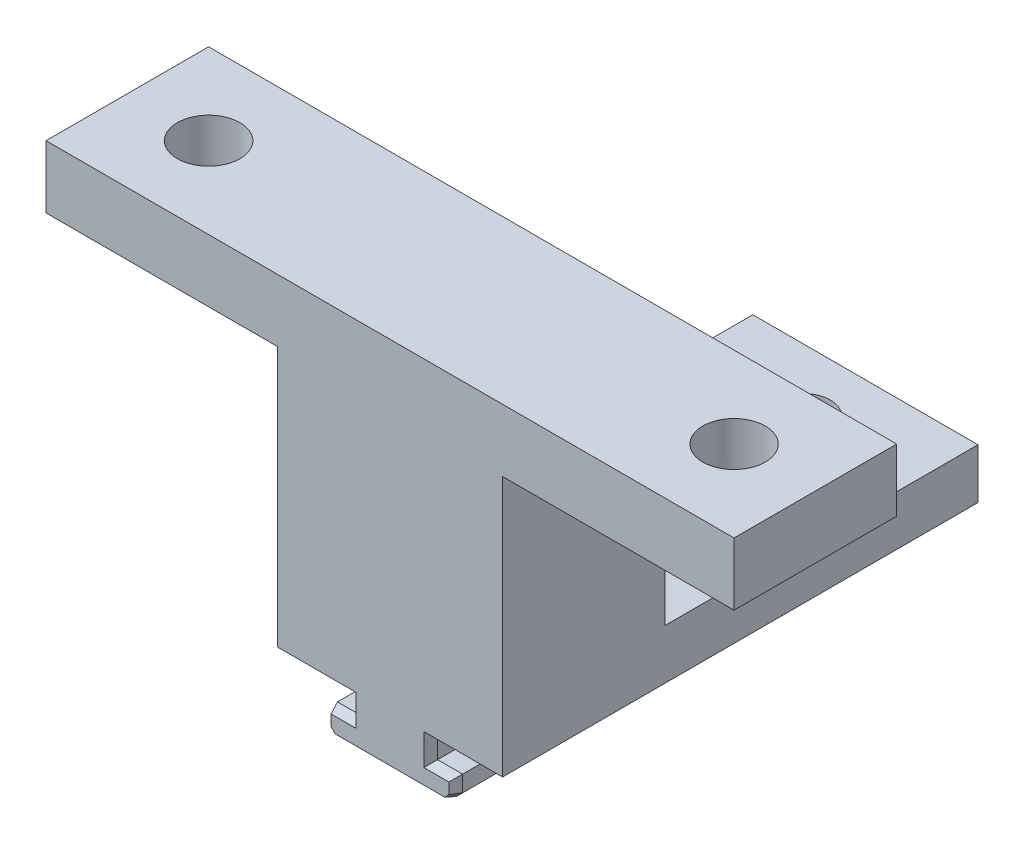
ISO-10303-21;
HEADER;
FILE_DESCRIPTION(('STEP AP214'),'2;1');
FILE_NAME('part.step','',(''),(''),'','','');
FILE_SCHEMA(('AUTOMOTIVE_DESIGN { 1 0 10303 214 1 1 1 1 }'));
ENDSEC;
DATA;
#1=APPLICATION_CONTEXT('core data for automotive mechanical design processes');
#2=APPLICATION_PROTOCOL_DEFINITION('international standard','automotive_design',2000,#1);
#3=PRODUCT_CONTEXT('',#1,'mechanical');
#4=PRODUCT('Part','Part','',(#3));
#5=PRODUCT_RELATED_PRODUCT_CATEGORY('part','',(#4));
#6=PRODUCT_DEFINITION_FORMATION('','',#4);
#7=PRODUCT_DEFINITION_CONTEXT('part definition',#1,'design');
#8=PRODUCT_DEFINITION('design','',#6,#7);
#9=PRODUCT_DEFINITION_SHAPE('','',#8);
#10=(LENGTH_UNIT() NAMED_UNIT(*) SI_UNIT(.MILLI.,.METRE.));
#11=(NAMED_UNIT(*) PLANE_ANGLE_UNIT() SI_UNIT($,.RADIAN.));
#12=(NAMED_UNIT(*) SI_UNIT($,.STERADIAN.) SOLID_ANGLE_UNIT());
#13=UNCERTAINTY_MEASURE_WITH_UNIT(LENGTH_MEASURE(1.E-05),#10,'distance_accuracy_value','');
#14=(GEOMETRIC_REPRESENTATION_CONTEXT(3) GLOBAL_UNCERTAINTY_ASSIGNED_CONTEXT((#13)) GLOBAL_UNIT_ASSIGNED_CONTEXT((#10,
#11,#12)) REPRESENTATION_CONTEXT('',''));
#15=CARTESIAN_POINT('',(0.,0.,0.));
#16=DIRECTION('',(0.,0.,1.));
#17=DIRECTION('',(1.,0.,0.));
#18=AXIS2_PLACEMENT_3D('',#15,#16,#17);
#19=CARTESIAN_POINT('',(0.,10.,13.));
#20=DIRECTION('',(0.,-1.,0.));
#21=DIRECTION('',(0.,0.,-1.));
#22=AXIS2_PLACEMENT_3D('',#19,#20,#21);
#23=PLANE('',#22);
#24=CARTESIAN_POINT('',(0.,10.,-20.));
#25=DIRECTION('',(0.,-1.,0.));
#26=DIRECTION('',(0.,0.,-1.));
#27=AXIS2_PLACEMENT_3D('',#24,#25,#26);
#28=CIRCLE('',#27,2.2);
#29=CARTESIAN_POINT('',(0.,10.,-22.2));
#30=VERTEX_POINT('',#29);
#31=EDGE_CURVE('E241',#30,#30,#28,.T.);
#32=ORIENTED_EDGE('',*,*,#31,.F.);
#33=EDGE_LOOP('',(#32));
#34=FACE_BOUND('',#33,.T.);
#35=DIRECTION('',(-1.,0.,0.));
#36=VECTOR('',#35,1.);
#37=CARTESIAN_POINT('',(0.,10.,13.));
#38=LINE('',#37,#36);
#39=CARTESIAN_POINT('',(9.,10.,13.));
#40=VERTEX_POINT('',#39);
#41=CARTESIAN_POINT('',(2.70882381258704,10.,13.));
#42=VERTEX_POINT('',#41);
#43=EDGE_CURVE('E390',#40,#42,#38,.T.);
#44=ORIENTED_EDGE('',*,*,#43,.T.);
#45=DIRECTION('',(-0.342020143325668,0.,0.939692620785909));
#46=VECTOR('',#45,1.);
#47=CARTESIAN_POINT('',(3.,10.,12.2));
#48=LINE('',#47,#46);
#49=CARTESIAN_POINT('',(3.,10.,12.2));
#50=VERTEX_POINT('',#49);
#51=EDGE_CURVE('E12',#42,#50,#48,.F.);
#52=ORIENTED_EDGE('',*,*,#51,.T.);
#53=DIRECTION('',(0.,0.,-1.));
#54=VECTOR('',#53,1.);
#55=CARTESIAN_POINT('',(3.,10.,13.));
#56=LINE('',#55,#54);
#57=CARTESIAN_POINT('',(3.,10.,-13.));
#58=VERTEX_POINT('',#57);
#59=EDGE_CURVE('E283',#50,#58,#56,.T.);
#60=ORIENTED_EDGE('',*,*,#59,.T.);
#61=DIRECTION('',(1.,0.,0.));
#62=VECTOR('',#61,1.);
#63=CARTESIAN_POINT('',(0.,10.,-13.));
#64=LINE('',#63,#62);
#65=CARTESIAN_POINT('',(-3.,10.,-13.));
#66=VERTEX_POINT('',#65);
#67=EDGE_CURVE('E240',#66,#58,#64,.T.);
#68=ORIENTED_EDGE('',*,*,#67,.F.);
#69=DIRECTION('',(0.,0.,-1.));
#70=VECTOR('',#69,1.);
#71=CARTESIAN_POINT('',(-3.,10.,13.));
#72=LINE('',#71,#70);
#73=CARTESIAN_POINT('',(-3.,10.,12.2));
#74=VERTEX_POINT('',#73);
#75=EDGE_CURVE('E273',#74,#66,#72,.T.);
#76=ORIENTED_EDGE('',*,*,#75,.F.);
#77=DIRECTION('',(0.342020143325668,0.,0.939692620785909));
#78=VECTOR('',#77,1.);
#79=CARTESIAN_POINT('',(-2.70882381258704,10.,13.));
#80=LINE('',#79,#78);
#81=CARTESIAN_POINT('',(-2.70882381258704,10.,13.));
#82=VERTEX_POINT('',#81);
#83=EDGE_CURVE('E46',#74,#82,#80,.T.);
#84=ORIENTED_EDGE('',*,*,#83,.T.);
#85=CARTESIAN_POINT('',(-9.,10.,13.));
#86=VERTEX_POINT('',#85);
#87=EDGE_CURVE('E217',#82,#86,#38,.T.);
#88=ORIENTED_EDGE('',*,*,#87,.T.);
#89=DIRECTION('',(0.,0.,-1.));
#90=VECTOR('',#89,1.);
#91=CARTESIAN_POINT('',(-9.,10.,13.));
#92=LINE('',#91,#90);
#93=CARTESIAN_POINT('',(-9.,10.,-25.));
#94=VERTEX_POINT('',#93);
#95=EDGE_CURVE('E276',#86,#94,#92,.T.);
#96=ORIENTED_EDGE('',*,*,#95,.T.);
#97=DIRECTION('',(-1.,0.,0.));
#98=VECTOR('',#97,1.);
#99=CARTESIAN_POINT('',(0.,10.,-25.));
#100=LINE('',#99,#98);
#101=CARTESIAN_POINT('',(9.,10.,-25.));
#102=VERTEX_POINT('',#101);
#103=EDGE_CURVE('E242',#102,#94,#100,.T.);
#104=ORIENTED_EDGE('',*,*,#103,.F.);
#105=DIRECTION('',(0.,0.,-1.));
#106=VECTOR('',#105,1.);
#107=CARTESIAN_POINT('',(9.,10.,13.));
#108=LINE('',#107,#106);
#109=EDGE_CURVE('E286',#40,#102,#108,.T.);
#110=ORIENTED_EDGE('',*,*,#109,.F.);
#111=EDGE_LOOP('',(#44,#52,#60,#68,#76,#84,#88,#96,#104,#110));
#112=FACE_BOUND('',#111,.T.);
#113=ADVANCED_FACE('F37',(#34,#112),#23,.T.);
#114=CARTESIAN_POINT('',(0.,0.,0.));
#115=DIRECTION('',(0.,0.,1.));
#116=DIRECTION('',(1.,0.,0.));
#117=AXIS2_PLACEMENT_3D('',#114,#115,#116);
#118=PLANE('',#117);
#119=DIRECTION('',(1.,0.,0.));
#120=VECTOR('',#119,1.);
#121=CARTESIAN_POINT('',(0.,14.,0.));
#122=LINE('',#121,#120);
#123=CARTESIAN_POINT('',(-9.,14.,0.));
#124=VERTEX_POINT('',#123);
#125=CARTESIAN_POINT('',(9.,14.,0.));
#126=VERTEX_POINT('',#125);
#127=EDGE_CURVE('E229',#124,#126,#122,.T.);
#128=ORIENTED_EDGE('',*,*,#127,.F.);
#129=DIRECTION('',(0.,1.,0.));
#130=VECTOR('',#129,1.);
#131=CARTESIAN_POINT('',(-9.,0.,0.));
#132=LINE('',#131,#130);
#133=CARTESIAN_POINT('',(-9.,30.8000000000001,0.));
#134=VERTEX_POINT('',#133);
#135=EDGE_CURVE('E387',#124,#134,#132,.T.);
#136=ORIENTED_EDGE('',*,*,#135,.T.);
#137=DIRECTION('',(-1.,0.,0.));
#138=VECTOR('',#137,1.);
#139=CARTESIAN_POINT('',(-1.09747046285582E-13,30.8000000000001,0.));
#140=LINE('',#139,#138);
#141=CARTESIAN_POINT('',(-27.5,30.8000000000001,0.));
#142=VERTEX_POINT('',#141);
#143=EDGE_CURVE('E391',#134,#142,#140,.T.);
#144=ORIENTED_EDGE('',*,*,#143,.T.);
#145=DIRECTION('',(0.,-1.,0.));
#146=VECTOR('',#145,1.);
#147=CARTESIAN_POINT('',(-27.5,0.,0.));
#148=LINE('',#147,#146);
#149=CARTESIAN_POINT('',(-27.5,35.8000000000001,0.));
#150=VERTEX_POINT('',#149);
#151=EDGE_CURVE('E574',#150,#142,#148,.T.);
#152=ORIENTED_EDGE('',*,*,#151,.F.);
#153=DIRECTION('',(1.,0.,0.));
#154=VECTOR('',#153,1.);
#155=CARTESIAN_POINT('',(0.,35.8000000000001,0.));
#156=LINE('',#155,#154);
#157=CARTESIAN_POINT('',(27.5,35.8000000000001,0.));
#158=VERTEX_POINT('',#157);
#159=EDGE_CURVE('E572',#150,#158,#156,.T.);
#160=ORIENTED_EDGE('',*,*,#159,.T.);
#161=DIRECTION('',(0.,-1.,0.));
#162=VECTOR('',#161,1.);
#163=CARTESIAN_POINT('',(27.5,0.,0.));
#164=LINE('',#163,#162);
#165=CARTESIAN_POINT('',(27.5,30.8000000000001,0.));
#166=VERTEX_POINT('',#165);
#167=EDGE_CURVE('E569',#158,#166,#164,.T.);
#168=ORIENTED_EDGE('',*,*,#167,.T.);
#169=DIRECTION('',(1.,0.,0.));
#170=VECTOR('',#169,1.);
#171=CARTESIAN_POINT('',(1.09747046285582E-13,30.8000000000001,0.));
#172=LINE('',#171,#170);
#173=CARTESIAN_POINT('',(9.,30.8000000000001,0.));
#174=VERTEX_POINT('',#173);
#175=EDGE_CURVE('E566',#174,#166,#172,.T.);
#176=ORIENTED_EDGE('',*,*,#175,.F.);
#177=DIRECTION('',(0.,1.,0.));
#178=VECTOR('',#177,1.);
#179=CARTESIAN_POINT('',(9.,0.,0.));
#180=LINE('',#179,#178);
#181=EDGE_CURVE('E392',#126,#174,#180,.T.);
#182=ORIENTED_EDGE('',*,*,#181,.F.);
#183=EDGE_LOOP('',(#128,#136,#144,#152,#160,#168,#176,#182));
#184=FACE_BOUND('',#183,.T.);
#185=ADVANCED_FACE('F453',(#184),#118,.F.);
#186=CARTESIAN_POINT('',(0.,7.8,13.));
#187=DIRECTION('',(0.,1.,0.));
#188=DIRECTION('',(0.,0.,1.));
#189=AXIS2_PLACEMENT_3D('',#186,#187,#188);
#190=PLANE('',#189);
#191=DIRECTION('',(0.,0.,-1.));
#192=VECTOR('',#191,1.);
#193=CARTESIAN_POINT('',(3.,7.8,13.));
#194=LINE('',#193,#192);
#195=CARTESIAN_POINT('',(3.,7.8,12.2));
#196=VERTEX_POINT('',#195);
#197=CARTESIAN_POINT('',(3.,7.8,-13.));
#198=VERTEX_POINT('',#197);
#199=EDGE_CURVE('E285',#196,#198,#194,.T.);
#200=ORIENTED_EDGE('',*,*,#199,.F.);
#201=DIRECTION('',(1.,0.,0.));
#202=VECTOR('',#201,1.);
#203=CARTESIAN_POINT('',(0.,7.8,12.2));
#204=LINE('',#203,#202);
#205=CARTESIAN_POINT('',(5.,7.8,12.2));
#206=VERTEX_POINT('',#205);
#207=EDGE_CURVE('E212',#196,#206,#204,.T.);
#208=ORIENTED_EDGE('',*,*,#207,.T.);
#209=DIRECTION('',(0.,0.,-1.));
#210=VECTOR('',#209,1.);
#211=CARTESIAN_POINT('',(5.,7.8,13.));
#212=LINE('',#211,#210);
#213=CARTESIAN_POINT('',(5.,7.8,-13.));
#214=VERTEX_POINT('',#213);
#215=EDGE_CURVE('E206',#206,#214,#212,.T.);
#216=ORIENTED_EDGE('',*,*,#215,.T.);
#217=DIRECTION('',(-1.,0.,0.));
#218=VECTOR('',#217,1.);
#219=CARTESIAN_POINT('',(0.,7.8,-13.));
#220=LINE('',#219,#218);
#221=EDGE_CURVE('E210',#214,#198,#220,.T.);
#222=ORIENTED_EDGE('',*,*,#221,.T.);
#223=EDGE_LOOP('',(#200,#208,#216,#222));
#224=FACE_BOUND('',#223,.T.);
#225=ADVANCED_FACE('F209',(#224),#190,.T.);
#226=CARTESIAN_POINT('',(3.,0.,13.));
#227=DIRECTION('',(1.,0.,0.));
#228=DIRECTION('',(0.,0.,-1.));
#229=AXIS2_PLACEMENT_3D('',#226,#227,#228);
#230=PLANE('',#229);
#231=ORIENTED_EDGE('',*,*,#59,.F.);
#232=DIRECTION('',(0.,-1.,0.));
#233=VECTOR('',#232,1.);
#234=CARTESIAN_POINT('',(3.,0.,12.2));
#235=LINE('',#234,#233);
#236=EDGE_CURVE('E282',#50,#196,#235,.T.);
#237=ORIENTED_EDGE('',*,*,#236,.T.);
#238=ORIENTED_EDGE('',*,*,#199,.T.);
#239=DIRECTION('',(0.,1.,0.));
#240=VECTOR('',#239,1.);
#241=CARTESIAN_POINT('',(3.,0.,-13.));
#242=LINE('',#241,#240);
#243=EDGE_CURVE('E228',#198,#58,#242,.T.);
#244=ORIENTED_EDGE('',*,*,#243,.T.);
#245=EDGE_LOOP('',(#231,#237,#238,#244));
#246=FACE_BOUND('',#245,.T.);
#247=ADVANCED_FACE('F491',(#246),#230,.T.);
#248=CARTESIAN_POINT('',(9.,0.,13.));
#249=DIRECTION('',(-1.,0.,0.));
#250=DIRECTION('',(0.,0.,1.));
#251=AXIS2_PLACEMENT_3D('',#248,#249,#250);
#252=PLANE('',#251);
#253=ORIENTED_EDGE('',*,*,#109,.T.);
#254=DIRECTION('',(0.,1.,0.));
#255=VECTOR('',#254,1.);
#256=CARTESIAN_POINT('',(9.,0.,-25.));
#257=LINE('',#256,#255);
#258=CARTESIAN_POINT('',(9.,14.,-25.));
#259=VERTEX_POINT('',#258);
#260=EDGE_CURVE('E245',#102,#259,#257,.T.);
#261=ORIENTED_EDGE('',*,*,#260,.T.);
#262=DIRECTION('',(0.,0.,1.));
#263=VECTOR('',#262,1.);
#264=CARTESIAN_POINT('',(9.,14.,-25.));
#265=LINE('',#264,#263);
#266=EDGE_CURVE('E252',#259,#126,#265,.T.);
#267=ORIENTED_EDGE('',*,*,#266,.T.);
#268=ORIENTED_EDGE('',*,*,#181,.T.);
#269=DIRECTION('',(0.,0.,-1.));
#270=VECTOR('',#269,1.);
#271=CARTESIAN_POINT('',(9.,30.8000000000001,13.));
#272=LINE('',#271,#270);
#273=CARTESIAN_POINT('',(9.,30.8000000000001,13.));
#274=VERTEX_POINT('',#273);
#275=EDGE_CURVE('E377',#274,#174,#272,.T.);
#276=ORIENTED_EDGE('',*,*,#275,.F.);
#277=DIRECTION('',(0.,1.,0.));
#278=VECTOR('',#277,1.);
#279=CARTESIAN_POINT('',(9.,0.,13.));
#280=LINE('',#279,#278);
#281=EDGE_CURVE('E549',#40,#274,#280,.T.);
#282=ORIENTED_EDGE('',*,*,#281,.F.);
#283=EDGE_LOOP('',(#253,#261,#267,#268,#276,#282));
#284=FACE_BOUND('',#283,.T.);
#285=ADVANCED_FACE('F487',(#284),#252,.F.);
#286=CARTESIAN_POINT('',(1.09747046285582E-13,30.8000000000001,13.));
#287=DIRECTION('',(0.,1.,0.));
#288=DIRECTION('',(-1.,0.,0.));
#289=AXIS2_PLACEMENT_3D('',#286,#287,#288);
#290=PLANE('',#289);
#291=CARTESIAN_POINT('',(21.,30.8000000000001,6.49999999999999));
#292=DIRECTION('',(0.,1.,0.));
#293=DIRECTION('',(-1.,0.,0.));
#294=AXIS2_PLACEMENT_3D('',#291,#292,#293);
#295=CIRCLE('',#294,2.5);
#296=CARTESIAN_POINT('',(18.5,30.8000000000001,6.49999999999999));
#297=VERTEX_POINT('',#296);
#298=EDGE_CURVE('E594',#297,#297,#295,.T.);
#299=ORIENTED_EDGE('',*,*,#298,.T.);
#300=EDGE_LOOP('',(#299));
#301=FACE_BOUND('',#300,.T.);
#302=ORIENTED_EDGE('',*,*,#175,.T.);
#303=DIRECTION('',(0.,0.,-1.));
#304=VECTOR('',#303,1.);
#305=CARTESIAN_POINT('',(27.5,30.8000000000001,13.));
#306=LINE('',#305,#304);
#307=CARTESIAN_POINT('',(27.5,30.8000000000001,13.));
#308=VERTEX_POINT('',#307);
#309=EDGE_CURVE('E375',#308,#166,#306,.T.);
#310=ORIENTED_EDGE('',*,*,#309,.F.);
#311=DIRECTION('',(1.,0.,0.));
#312=VECTOR('',#311,1.);
#313=CARTESIAN_POINT('',(1.09747046285582E-13,30.8000000000001,13.));
#314=LINE('',#313,#312);
#315=EDGE_CURVE('E550',#274,#308,#314,.T.);
#316=ORIENTED_EDGE('',*,*,#315,.F.);
#317=ORIENTED_EDGE('',*,*,#275,.T.);
#318=EDGE_LOOP('',(#302,#310,#316,#317));
#319=FACE_BOUND('',#318,.T.);
#320=ADVANCED_FACE('F483',(#301,#319),#290,.F.);
#321=CARTESIAN_POINT('',(27.5,0.,13.));
#322=DIRECTION('',(1.,0.,0.));
#323=DIRECTION('',(0.,1.,0.));
#324=AXIS2_PLACEMENT_3D('',#321,#322,#323);
#325=PLANE('',#324);
#326=ORIENTED_EDGE('',*,*,#167,.F.);
#327=DIRECTION('',(0.,0.,-1.));
#328=VECTOR('',#327,1.);
#329=CARTESIAN_POINT('',(27.5,35.8000000000001,13.));
#330=LINE('',#329,#328);
#331=CARTESIAN_POINT('',(27.5,35.8000000000001,13.));
#332=VERTEX_POINT('',#331);
#333=EDGE_CURVE('E373',#332,#158,#330,.T.);
#334=ORIENTED_EDGE('',*,*,#333,.F.);
#335=DIRECTION('',(0.,-1.,0.));
#336=VECTOR('',#335,1.);
#337=CARTESIAN_POINT('',(27.5,0.,13.));
#338=LINE('',#337,#336);
#339=EDGE_CURVE('E553',#332,#308,#338,.T.);
#340=ORIENTED_EDGE('',*,*,#339,.T.);
#341=ORIENTED_EDGE('',*,*,#309,.T.);
#342=EDGE_LOOP('',(#326,#334,#340,#341));
#343=FACE_BOUND('',#342,.T.);
#344=ADVANCED_FACE('F479',(#343),#325,.T.);
#345=CARTESIAN_POINT('',(0.,35.8000000000001,13.));
#346=DIRECTION('',(0.,1.,0.));
#347=DIRECTION('',(0.,0.,1.));
#348=AXIS2_PLACEMENT_3D('',#345,#346,#347);
#349=PLANE('',#348);
#350=CARTESIAN_POINT('',(-21.,35.8000000000001,6.5));
#351=DIRECTION('',(0.,1.,0.));
#352=DIRECTION('',(0.,0.,-1.));
#353=AXIS2_PLACEMENT_3D('',#350,#351,#352);
#354=CIRCLE('',#353,2.5);
#355=CARTESIAN_POINT('',(-21.,35.8000000000001,4.));
#356=VERTEX_POINT('',#355);
#357=EDGE_CURVE('E255',#356,#356,#354,.T.);
#358=ORIENTED_EDGE('',*,*,#357,.F.);
#359=EDGE_LOOP('',(#358));
#360=FACE_BOUND('',#359,.T.);
#361=CARTESIAN_POINT('',(21.,35.8000000000001,6.49999999999999));
#362=DIRECTION('',(0.,1.,0.));
#363=DIRECTION('',(0.,0.,1.));
#364=AXIS2_PLACEMENT_3D('',#361,#362,#363);
#365=CIRCLE('',#364,2.5);
#366=CARTESIAN_POINT('',(21.,35.8000000000001,8.99999999999999));
#367=VERTEX_POINT('',#366);
#368=EDGE_CURVE('E386',#367,#367,#365,.T.);
#369=ORIENTED_EDGE('',*,*,#368,.F.);
#370=EDGE_LOOP('',(#369));
#371=FACE_BOUND('',#370,.T.);
#372=ORIENTED_EDGE('',*,*,#159,.F.);
#373=DIRECTION('',(0.,0.,-1.));
#374=VECTOR('',#373,1.);
#375=CARTESIAN_POINT('',(-27.5,35.8000000000001,13.));
#376=LINE('',#375,#374);
#377=CARTESIAN_POINT('',(-27.5,35.8000000000001,13.));
#378=VERTEX_POINT('',#377);
#379=EDGE_CURVE('E371',#378,#150,#376,.T.);
#380=ORIENTED_EDGE('',*,*,#379,.F.);
#381=DIRECTION('',(1.,0.,0.));
#382=VECTOR('',#381,1.);
#383=CARTESIAN_POINT('',(0.,35.8000000000001,13.));
#384=LINE('',#383,#382);
#385=EDGE_CURVE('E558',#378,#332,#384,.T.);
#386=ORIENTED_EDGE('',*,*,#385,.T.);
#387=ORIENTED_EDGE('',*,*,#333,.T.);
#388=EDGE_LOOP('',(#372,#380,#386,#387));
#389=FACE_BOUND('',#388,.T.);
#390=ADVANCED_FACE('F475',(#360,#371,#389),#349,.T.);
#391=CARTESIAN_POINT('',(-27.5,0.,13.));
#392=DIRECTION('',(1.,0.,0.));
#393=DIRECTION('',(0.,1.,0.));
#394=AXIS2_PLACEMENT_3D('',#391,#392,#393);
#395=PLANE('',#394);
#396=ORIENTED_EDGE('',*,*,#151,.T.);
#397=DIRECTION('',(0.,0.,-1.));
#398=VECTOR('',#397,1.);
#399=CARTESIAN_POINT('',(-27.5,30.8000000000001,13.));
#400=LINE('',#399,#398);
#401=CARTESIAN_POINT('',(-27.5,30.8000000000001,13.));
#402=VERTEX_POINT('',#401);
#403=EDGE_CURVE('E369',#402,#142,#400,.T.);
#404=ORIENTED_EDGE('',*,*,#403,.F.);
#405=DIRECTION('',(0.,-1.,0.));
#406=VECTOR('',#405,1.);
#407=CARTESIAN_POINT('',(-27.5,0.,13.));
#408=LINE('',#407,#406);
#409=EDGE_CURVE('E561',#378,#402,#408,.T.);
#410=ORIENTED_EDGE('',*,*,#409,.F.);
#411=ORIENTED_EDGE('',*,*,#379,.T.);
#412=EDGE_LOOP('',(#396,#404,#410,#411));
#413=FACE_BOUND('',#412,.T.);
#414=ADVANCED_FACE('F471',(#413),#395,.F.);
#415=CARTESIAN_POINT('',(-1.09747046285582E-13,30.8000000000001,13.));
#416=DIRECTION('',(0.,-1.,0.));
#417=DIRECTION('',(1.,0.,0.));
#418=AXIS2_PLACEMENT_3D('',#415,#416,#417);
#419=PLANE('',#418);
#420=CARTESIAN_POINT('',(-21.,30.8000000000001,6.5));
#421=DIRECTION('',(0.,-1.,0.));
#422=DIRECTION('',(1.,0.,0.));
#423=AXIS2_PLACEMENT_3D('',#420,#421,#422);
#424=CIRCLE('',#423,2.5);
#425=CARTESIAN_POINT('',(-18.5,30.8000000000001,6.5));
#426=VERTEX_POINT('',#425);
#427=EDGE_CURVE('E383',#426,#426,#424,.T.);
#428=ORIENTED_EDGE('',*,*,#427,.F.);
#429=EDGE_LOOP('',(#428));
#430=FACE_BOUND('',#429,.T.);
#431=ORIENTED_EDGE('',*,*,#143,.F.);
#432=DIRECTION('',(0.,0.,-1.));
#433=VECTOR('',#432,1.);
#434=CARTESIAN_POINT('',(-9.,30.8000000000001,13.));
#435=LINE('',#434,#433);
#436=CARTESIAN_POINT('',(-9.,30.8000000000001,13.));
#437=VERTEX_POINT('',#436);
#438=EDGE_CURVE('E366',#437,#134,#435,.T.);
#439=ORIENTED_EDGE('',*,*,#438,.F.);
#440=DIRECTION('',(-1.,0.,0.));
#441=VECTOR('',#440,1.);
#442=CARTESIAN_POINT('',(-1.09747046285582E-13,30.8000000000001,13.));
#443=LINE('',#442,#441);
#444=EDGE_CURVE('E545',#437,#402,#443,.T.);
#445=ORIENTED_EDGE('',*,*,#444,.T.);
#446=ORIENTED_EDGE('',*,*,#403,.T.);
#447=EDGE_LOOP('',(#431,#439,#445,#446));
#448=FACE_BOUND('',#447,.T.);
#449=ADVANCED_FACE('F467',(#430,#448),#419,.T.);
#450=CARTESIAN_POINT('',(-9.,0.,13.));
#451=DIRECTION('',(-1.,0.,0.));
#452=DIRECTION('',(0.,0.,1.));
#453=AXIS2_PLACEMENT_3D('',#450,#451,#452);
#454=PLANE('',#453);
#455=ORIENTED_EDGE('',*,*,#135,.F.);
#456=DIRECTION('',(0.,0.,1.));
#457=VECTOR('',#456,1.);
#458=CARTESIAN_POINT('',(-9.,14.,-25.));
#459=LINE('',#458,#457);
#460=CARTESIAN_POINT('',(-9.,14.,-25.));
#461=VERTEX_POINT('',#460);
#462=EDGE_CURVE('E263',#461,#124,#459,.T.);
#463=ORIENTED_EDGE('',*,*,#462,.F.);
#464=DIRECTION('',(0.,1.,0.));
#465=VECTOR('',#464,1.);
#466=CARTESIAN_POINT('',(-9.,0.,-25.));
#467=LINE('',#466,#465);
#468=EDGE_CURVE('E250',#94,#461,#467,.T.);
#469=ORIENTED_EDGE('',*,*,#468,.F.);
#470=ORIENTED_EDGE('',*,*,#95,.F.);
#471=DIRECTION('',(0.,1.,0.));
#472=VECTOR('',#471,1.);
#473=CARTESIAN_POINT('',(-9.,0.,13.));
#474=LINE('',#473,#472);
#475=EDGE_CURVE('E543',#86,#437,#474,.T.);
#476=ORIENTED_EDGE('',*,*,#475,.T.);
#477=ORIENTED_EDGE('',*,*,#438,.T.);
#478=EDGE_LOOP('',(#455,#463,#469,#470,#476,#477));
#479=FACE_BOUND('',#478,.T.);
#480=ADVANCED_FACE('F464',(#479),#454,.T.);
#481=CARTESIAN_POINT('',(-3.,0.,13.));
#482=DIRECTION('',(1.,0.,0.));
#483=DIRECTION('',(0.,0.,-1.));
#484=AXIS2_PLACEMENT_3D('',#481,#482,#483);
#485=PLANE('',#484);
#486=DIRECTION('',(0.,0.,-1.));
#487=VECTOR('',#486,1.);
#488=CARTESIAN_POINT('',(-3.,7.8,13.));
#489=LINE('',#488,#487);
#490=CARTESIAN_POINT('',(-3.,7.8,12.2));
#491=VERTEX_POINT('',#490);
#492=CARTESIAN_POINT('',(-3.,7.8,-13.));
#493=VERTEX_POINT('',#492);
#494=EDGE_CURVE('E277',#491,#493,#489,.T.);
#495=ORIENTED_EDGE('',*,*,#494,.F.);
#496=DIRECTION('',(0.,1.,0.));
#497=VECTOR('',#496,1.);
#498=CARTESIAN_POINT('',(-3.,10.,12.2));
#499=LINE('',#498,#497);
#500=EDGE_CURVE('E280',#491,#74,#499,.T.);
#501=ORIENTED_EDGE('',*,*,#500,.T.);
#502=ORIENTED_EDGE('',*,*,#75,.T.);
#503=DIRECTION('',(0.,1.,0.));
#504=VECTOR('',#503,1.);
#505=CARTESIAN_POINT('',(-3.,0.,-13.));
#506=LINE('',#505,#504);
#507=EDGE_CURVE('E335',#493,#66,#506,.T.);
#508=ORIENTED_EDGE('',*,*,#507,.F.);
#509=EDGE_LOOP('',(#495,#501,#502,#508));
#510=FACE_BOUND('',#509,.T.);
#511=ADVANCED_FACE('F432',(#510),#485,.F.);
#512=CARTESIAN_POINT('',(0.,7.8,13.));
#513=DIRECTION('',(0.,-1.,0.));
#514=DIRECTION('',(0.,0.,-1.));
#515=AXIS2_PLACEMENT_3D('',#512,#513,#514);
#516=PLANE('',#515);
#517=DIRECTION('',(0.,0.,-1.));
#518=VECTOR('',#517,1.);
#519=CARTESIAN_POINT('',(-5.,7.8,13.));
#520=LINE('',#519,#518);
#521=CARTESIAN_POINT('',(-5.,7.8,12.2));
#522=VERTEX_POINT('',#521);
#523=CARTESIAN_POINT('',(-5.,7.8,-13.));
#524=VERTEX_POINT('',#523);
#525=EDGE_CURVE('E357',#522,#524,#520,.T.);
#526=ORIENTED_EDGE('',*,*,#525,.F.);
#527=DIRECTION('',(1.,0.,0.));
#528=VECTOR('',#527,1.);
#529=CARTESIAN_POINT('',(-3.,7.8,12.2));
#530=LINE('',#529,#528);
#531=EDGE_CURVE('E295',#522,#491,#530,.T.);
#532=ORIENTED_EDGE('',*,*,#531,.T.);
#533=ORIENTED_EDGE('',*,*,#494,.T.);
#534=DIRECTION('',(1.,0.,0.));
#535=VECTOR('',#534,1.);
#536=CARTESIAN_POINT('',(0.,7.8,-13.));
#537=LINE('',#536,#535);
#538=EDGE_CURVE('E338',#524,#493,#537,.T.);
#539=ORIENTED_EDGE('',*,*,#538,.F.);
#540=EDGE_LOOP('',(#526,#532,#533,#539));
#541=FACE_BOUND('',#540,.T.);
#542=ADVANCED_FACE('F427',(#541),#516,.F.);
#543=CARTESIAN_POINT('',(-4.99999999999999,0.,13.));
#544=DIRECTION('',(1.,0.,0.));
#545=DIRECTION('',(0.,1.,0.));
#546=AXIS2_PLACEMENT_3D('',#543,#544,#545);
#547=PLANE('',#546);
#548=DIRECTION('',(0.,0.,-1.));
#549=VECTOR('',#548,1.);
#550=CARTESIAN_POINT('',(-5.,6.5,13.));
#551=LINE('',#550,#549);
#552=CARTESIAN_POINT('',(-5.,6.5,12.2));
#553=VERTEX_POINT('',#552);
#554=CARTESIAN_POINT('',(-5.,6.5,-13.));
#555=VERTEX_POINT('',#554);
#556=EDGE_CURVE('E355',#553,#555,#551,.T.);
#557=ORIENTED_EDGE('',*,*,#556,.F.);
#558=DIRECTION('',(0.,1.,0.));
#559=VECTOR('',#558,1.);
#560=CARTESIAN_POINT('',(-5.,7.8,12.2));
#561=LINE('',#560,#559);
#562=EDGE_CURVE('E61',#553,#522,#561,.T.);
#563=ORIENTED_EDGE('',*,*,#562,.T.);
#564=ORIENTED_EDGE('',*,*,#525,.T.);
#565=DIRECTION('',(0.,1.,0.));
#566=VECTOR('',#565,1.);
#567=CARTESIAN_POINT('',(-4.99999999999999,0.,-13.));
#568=LINE('',#567,#566);
#569=EDGE_CURVE('E341',#555,#524,#568,.T.);
#570=ORIENTED_EDGE('',*,*,#569,.F.);
#571=EDGE_LOOP('',(#557,#563,#564,#570));
#572=FACE_BOUND('',#571,.T.);
#573=ADVANCED_FACE('F443',(#572),#547,.F.);
#574=CARTESIAN_POINT('',(0.75,0.75,13.));
#575=DIRECTION('',(0.707106781186548,0.707106781186548,0.));
#576=DIRECTION('',(-0.707106781186548,0.707106781186548,0.));
#577=AXIS2_PLACEMENT_3D('',#574,#575,#576);
#578=PLANE('',#577);
#579=DIRECTION('',(0.,0.,-1.));
#580=VECTOR('',#579,1.);
#581=CARTESIAN_POINT('',(-4.5,6.,13.));
#582=LINE('',#581,#580);
#583=CARTESIAN_POINT('',(-4.5,6.,12.2));
#584=VERTEX_POINT('',#583);
#585=CARTESIAN_POINT('',(-4.5,6.,-13.));
#586=VERTEX_POINT('',#585);
#587=EDGE_CURVE('E353',#584,#586,#582,.T.);
#588=ORIENTED_EDGE('',*,*,#587,.F.);
#589=DIRECTION('',(-0.707106781186548,0.707106781186548,0.));
#590=VECTOR('',#589,1.);
#591=CARTESIAN_POINT('',(-5.,6.5,12.2));
#592=LINE('',#591,#590);
#593=EDGE_CURVE('E54',#584,#553,#592,.T.);
#594=ORIENTED_EDGE('',*,*,#593,.T.);
#595=ORIENTED_EDGE('',*,*,#556,.T.);
#596=DIRECTION('',(-0.707106781186548,0.707106781186548,0.));
#597=VECTOR('',#596,1.);
#598=CARTESIAN_POINT('',(0.75,0.75,-13.));
#599=LINE('',#598,#597);
#600=EDGE_CURVE('E344',#586,#555,#599,.T.);
#601=ORIENTED_EDGE('',*,*,#600,.F.);
#602=EDGE_LOOP('',(#588,#594,#595,#601));
#603=FACE_BOUND('',#602,.T.);
#604=ADVANCED_FACE('F352',(#603),#578,.F.);
#605=CARTESIAN_POINT('',(0.,6.,13.));
#606=DIRECTION('',(0.,1.,0.));
#607=DIRECTION('',(0.,0.,1.));
#608=AXIS2_PLACEMENT_3D('',#605,#606,#607);
#609=PLANE('',#608);
#610=DIRECTION('',(0.,0.,-1.));
#611=VECTOR('',#610,1.);
#612=CARTESIAN_POINT('',(4.5,6.,13.));
#613=LINE('',#612,#611);
#614=CARTESIAN_POINT('',(4.5,6.,12.2));
#615=VERTEX_POINT('',#614);
#616=CARTESIAN_POINT('',(4.5,6.,-13.));
#617=VERTEX_POINT('',#616);
#618=EDGE_CURVE('E360',#615,#617,#613,.T.);
#619=ORIENTED_EDGE('',*,*,#618,.F.);
#620=DIRECTION('',(-1.,0.,0.));
#621=VECTOR('',#620,1.);
#622=CARTESIAN_POINT('',(-4.5,6.,12.2));
#623=LINE('',#622,#621);
#624=EDGE_CURVE('E293',#615,#584,#623,.T.);
#625=ORIENTED_EDGE('',*,*,#624,.T.);
#626=ORIENTED_EDGE('',*,*,#587,.T.);
#627=DIRECTION('',(-1.,0.,0.));
#628=VECTOR('',#627,1.);
#629=CARTESIAN_POINT('',(0.,6.,-13.));
#630=LINE('',#629,#628);
#631=EDGE_CURVE('E235',#617,#586,#630,.T.);
#632=ORIENTED_EDGE('',*,*,#631,.F.);
#633=EDGE_LOOP('',(#619,#625,#626,#632));
#634=FACE_BOUND('',#633,.T.);
#635=ADVANCED_FACE('F402',(#634),#609,.F.);
#636=CARTESIAN_POINT('',(-0.75,0.75,13.));
#637=DIRECTION('',(0.707106781186548,-0.707106781186548,0.));
#638=DIRECTION('',(0.707106781186548,0.707106781186548,0.));
#639=AXIS2_PLACEMENT_3D('',#636,#637,#638);
#640=PLANE('',#639);
#641=DIRECTION('',(0.,0.,-1.));
#642=VECTOR('',#641,1.);
#643=CARTESIAN_POINT('',(5.,6.5,13.));
#644=LINE('',#643,#642);
#645=CARTESIAN_POINT('',(5.,6.5,12.2));
#646=VERTEX_POINT('',#645);
#647=CARTESIAN_POINT('',(5.,6.5,-13.));
#648=VERTEX_POINT('',#647);
#649=EDGE_CURVE('E216',#646,#648,#644,.T.);
#650=ORIENTED_EDGE('',*,*,#649,.F.);
#651=DIRECTION('',(-0.707106781186548,-0.707106781186548,0.));
#652=VECTOR('',#651,1.);
#653=CARTESIAN_POINT('',(-0.75,0.75,12.2));
#654=LINE('',#653,#652);
#655=EDGE_CURVE('E291',#646,#615,#654,.T.);
#656=ORIENTED_EDGE('',*,*,#655,.T.);
#657=ORIENTED_EDGE('',*,*,#618,.T.);
#658=DIRECTION('',(0.707106781186548,0.707106781186548,0.));
#659=VECTOR('',#658,1.);
#660=CARTESIAN_POINT('',(-0.75,0.75,-13.));
#661=LINE('',#660,#659);
#662=EDGE_CURVE('E233',#617,#648,#661,.T.);
#663=ORIENTED_EDGE('',*,*,#662,.T.);
#664=EDGE_LOOP('',(#650,#656,#657,#663));
#665=FACE_BOUND('',#664,.T.);
#666=ADVANCED_FACE('F399',(#665),#640,.T.);
#667=CARTESIAN_POINT('',(4.99999999999999,0.,13.));
#668=DIRECTION('',(1.,0.,0.));
#669=DIRECTION('',(0.,1.,0.));
#670=AXIS2_PLACEMENT_3D('',#667,#668,#669);
#671=PLANE('',#670);
#672=ORIENTED_EDGE('',*,*,#215,.F.);
#673=DIRECTION('',(0.,-1.,0.));
#674=VECTOR('',#673,1.);
#675=CARTESIAN_POINT('',(4.99999999999999,0.,12.2));
#676=LINE('',#675,#674);
#677=EDGE_CURVE('E289',#206,#646,#676,.T.);
#678=ORIENTED_EDGE('',*,*,#677,.T.);
#679=ORIENTED_EDGE('',*,*,#649,.T.);
#680=DIRECTION('',(0.,1.,0.));
#681=VECTOR('',#680,1.);
#682=CARTESIAN_POINT('',(4.99999999999999,0.,-13.));
#683=LINE('',#682,#681);
#684=EDGE_CURVE('E224',#648,#214,#683,.T.);
#685=ORIENTED_EDGE('',*,*,#684,.T.);
#686=EDGE_LOOP('',(#672,#678,#679,#685));
#687=FACE_BOUND('',#686,.T.);
#688=ADVANCED_FACE('F231',(#687),#671,.T.);
#689=CARTESIAN_POINT('',(0.,0.,13.));
#690=DIRECTION('',(0.,0.,1.));
#691=DIRECTION('',(1.,0.,0.));
#692=AXIS2_PLACEMENT_3D('',#689,#690,#691);
#693=PLANE('',#692);
#694=ORIENTED_EDGE('',*,*,#87,.F.);
#695=DIRECTION('',(0.,-1.,0.));
#696=VECTOR('',#695,1.);
#697=CARTESIAN_POINT('',(-2.70882381258704,7.8,13.));
#698=LINE('',#697,#696);
#699=CARTESIAN_POINT('',(-2.70882381258704,7.50882381258704,13.));
#700=VERTEX_POINT('',#699);
#701=EDGE_CURVE('E278',#82,#700,#698,.T.);
#702=ORIENTED_EDGE('',*,*,#701,.T.);
#703=DIRECTION('',(-1.,0.,0.));
#704=VECTOR('',#703,1.);
#705=CARTESIAN_POINT('',(-5.,7.50882381258704,13.));
#706=LINE('',#705,#704);
#707=CARTESIAN_POINT('',(-4.70882381258704,7.50882381258704,13.));
#708=VERTEX_POINT('',#707);
#709=EDGE_CURVE('E539',#700,#708,#706,.T.);
#710=ORIENTED_EDGE('',*,*,#709,.T.);
#711=DIRECTION('',(0.,-1.,0.));
#712=VECTOR('',#711,1.);
#713=CARTESIAN_POINT('',(-4.70882381258704,6.5,13.));
#714=LINE('',#713,#712);
#715=CARTESIAN_POINT('',(-4.70882381258704,6.62060912586654,13.));
#716=VERTEX_POINT('',#715);
#717=EDGE_CURVE('E420',#708,#716,#714,.T.);
#718=ORIENTED_EDGE('',*,*,#717,.T.);
#719=DIRECTION('',(0.707106781186548,-0.707106781186548,0.));
#720=VECTOR('',#719,1.);
#721=CARTESIAN_POINT('',(-4.29410734336025,6.20589265663975,13.));
#722=LINE('',#721,#720);
#723=CARTESIAN_POINT('',(-4.37939087413346,6.29117618741296,13.));
#724=VERTEX_POINT('',#723);
#725=EDGE_CURVE('E382',#716,#724,#722,.T.);
#726=ORIENTED_EDGE('',*,*,#725,.T.);
#727=DIRECTION('',(1.,0.,0.));
#728=VECTOR('',#727,1.);
#729=CARTESIAN_POINT('',(4.5,6.29117618741296,13.));
#730=LINE('',#729,#728);
#731=CARTESIAN_POINT('',(4.37939087413346,6.29117618741296,13.));
#732=VERTEX_POINT('',#731);
#733=EDGE_CURVE('E411',#724,#732,#730,.T.);
#734=ORIENTED_EDGE('',*,*,#733,.T.);
#735=DIRECTION('',(0.707106781186548,0.707106781186548,0.));
#736=VECTOR('',#735,1.);
#737=CARTESIAN_POINT('',(-0.955892656639749,0.955892656639749,13.));
#738=LINE('',#737,#736);
#739=CARTESIAN_POINT('',(4.70882381258704,6.62060912586654,13.));
#740=VERTEX_POINT('',#739);
#741=EDGE_CURVE('E407',#732,#740,#738,.T.);
#742=ORIENTED_EDGE('',*,*,#741,.T.);
#743=DIRECTION('',(0.,1.,0.));
#744=VECTOR('',#743,1.);
#745=CARTESIAN_POINT('',(4.70882381258704,0.,13.));
#746=LINE('',#745,#744);
#747=CARTESIAN_POINT('',(4.70882381258704,7.50882381258704,13.));
#748=VERTEX_POINT('',#747);
#749=EDGE_CURVE('E532',#740,#748,#746,.T.);
#750=ORIENTED_EDGE('',*,*,#749,.T.);
#751=DIRECTION('',(-1.,0.,0.));
#752=VECTOR('',#751,1.);
#753=CARTESIAN_POINT('',(0.,7.50882381258704,13.));
#754=LINE('',#753,#752);
#755=CARTESIAN_POINT('',(2.70882381258704,7.50882381258704,13.));
#756=VERTEX_POINT('',#755);
#757=EDGE_CURVE('E530',#748,#756,#754,.T.);
#758=ORIENTED_EDGE('',*,*,#757,.T.);
#759=DIRECTION('',(0.,1.,0.));
#760=VECTOR('',#759,1.);
#761=CARTESIAN_POINT('',(2.70882381258704,0.,13.));
#762=LINE('',#761,#760);
#763=EDGE_CURVE('E528',#756,#42,#762,.T.);
#764=ORIENTED_EDGE('',*,*,#763,.T.);
#765=ORIENTED_EDGE('',*,*,#43,.F.);
#766=ORIENTED_EDGE('',*,*,#281,.T.);
#767=ORIENTED_EDGE('',*,*,#315,.T.);
#768=ORIENTED_EDGE('',*,*,#339,.F.);
#769=ORIENTED_EDGE('',*,*,#385,.F.);
#770=ORIENTED_EDGE('',*,*,#409,.T.);
#771=ORIENTED_EDGE('',*,*,#444,.F.);
#772=ORIENTED_EDGE('',*,*,#475,.F.);
#773=EDGE_LOOP('',(#694,#702,#710,#718,#726,#734,#742,#750,#758,#764,#765,#766,#767,#768,#769,
#770,#771,#772));
#774=FACE_BOUND('',#773,.T.);
#775=ADVANCED_FACE('F538',(#774),#693,.T.);
#776=CARTESIAN_POINT('',(21.,6.,6.49999999999999));
#777=DIRECTION('',(0.,1.,0.));
#778=DIRECTION('',(0.,0.,1.));
#779=AXIS2_PLACEMENT_3D('',#776,#777,#778);
#780=CYLINDRICAL_SURFACE('',#779,2.5);
#781=ORIENTED_EDGE('',*,*,#368,.T.);
#782=EDGE_LOOP('',(#781));
#783=FACE_BOUND('',#782,.T.);
#784=ORIENTED_EDGE('',*,*,#298,.F.);
#785=EDGE_LOOP('',(#784));
#786=FACE_BOUND('',#785,.T.);
#787=ADVANCED_FACE('F600',(#783,#786),#780,.F.);
#788=CARTESIAN_POINT('',(-21.,6.,6.5));
#789=DIRECTION('',(0.,1.,0.));
#790=DIRECTION('',(0.,0.,1.));
#791=AXIS2_PLACEMENT_3D('',#788,#789,#790);
#792=CYLINDRICAL_SURFACE('',#791,2.5);
#793=ORIENTED_EDGE('',*,*,#427,.T.);
#794=EDGE_LOOP('',(#793));
#795=FACE_BOUND('',#794,.T.);
#796=ORIENTED_EDGE('',*,*,#357,.T.);
#797=EDGE_LOOP('',(#796));
#798=FACE_BOUND('',#797,.T.);
#799=ADVANCED_FACE('F604',(#795,#798),#792,.F.);
#800=CARTESIAN_POINT('',(0.,14.,-25.));
#801=DIRECTION('',(0.,-1.,0.));
#802=DIRECTION('',(0.,0.,-1.));
#803=AXIS2_PLACEMENT_3D('',#800,#801,#802);
#804=PLANE('',#803);
#805=CARTESIAN_POINT('',(0.,14.,-20.));
#806=DIRECTION('',(0.,1.,0.));
#807=DIRECTION('',(0.,0.,1.));
#808=AXIS2_PLACEMENT_3D('',#805,#806,#807);
#809=CIRCLE('',#808,2.2);
#810=CARTESIAN_POINT('',(0.,14.,-17.8));
#811=VERTEX_POINT('',#810);
#812=EDGE_CURVE('E323',#811,#811,#809,.T.);
#813=ORIENTED_EDGE('',*,*,#812,.F.);
#814=EDGE_LOOP('',(#813));
#815=FACE_BOUND('',#814,.T.);
#816=ORIENTED_EDGE('',*,*,#127,.T.);
#817=ORIENTED_EDGE('',*,*,#266,.F.);
#818=DIRECTION('',(1.,0.,0.));
#819=VECTOR('',#818,1.);
#820=CARTESIAN_POINT('',(0.,14.,-25.));
#821=LINE('',#820,#819);
#822=EDGE_CURVE('E248',#461,#259,#821,.T.);
#823=ORIENTED_EDGE('',*,*,#822,.F.);
#824=ORIENTED_EDGE('',*,*,#462,.T.);
#825=EDGE_LOOP('',(#816,#817,#823,#824));
#826=FACE_BOUND('',#825,.T.);
#827=ADVANCED_FACE('F610',(#815,#826),#804,.F.);
#828=CARTESIAN_POINT('',(0.,0.,-25.));
#829=DIRECTION('',(0.,0.,1.));
#830=DIRECTION('',(1.,0.,0.));
#831=AXIS2_PLACEMENT_3D('',#828,#829,#830);
#832=PLANE('',#831);
#833=ORIENTED_EDGE('',*,*,#103,.T.);
#834=ORIENTED_EDGE('',*,*,#468,.T.);
#835=ORIENTED_EDGE('',*,*,#822,.T.);
#836=ORIENTED_EDGE('',*,*,#260,.F.);
#837=EDGE_LOOP('',(#833,#834,#835,#836));
#838=FACE_BOUND('',#837,.T.);
#839=ADVANCED_FACE('F704',(#838),#832,.F.);
#840=CARTESIAN_POINT('',(0.,0.,-13.));
#841=DIRECTION('',(0.,0.,1.));
#842=DIRECTION('',(1.,0.,0.));
#843=AXIS2_PLACEMENT_3D('',#840,#841,#842);
#844=PLANE('',#843);
#845=ORIENTED_EDGE('',*,*,#684,.F.);
#846=ORIENTED_EDGE('',*,*,#662,.F.);
#847=ORIENTED_EDGE('',*,*,#631,.T.);
#848=ORIENTED_EDGE('',*,*,#600,.T.);
#849=ORIENTED_EDGE('',*,*,#569,.T.);
#850=ORIENTED_EDGE('',*,*,#538,.T.);
#851=ORIENTED_EDGE('',*,*,#507,.T.);
#852=ORIENTED_EDGE('',*,*,#67,.T.);
#853=ORIENTED_EDGE('',*,*,#243,.F.);
#854=ORIENTED_EDGE('',*,*,#221,.F.);
#855=EDGE_LOOP('',(#845,#846,#847,#848,#849,#850,#851,#852,#853,#854));
#856=FACE_BOUND('',#855,.T.);
#857=ADVANCED_FACE('F222',(#856),#844,.F.);
#858=CARTESIAN_POINT('',(0.,6.,-20.));
#859=DIRECTION('',(0.,1.,0.));
#860=DIRECTION('',(0.,0.,1.));
#861=AXIS2_PLACEMENT_3D('',#858,#859,#860);
#862=CYLINDRICAL_SURFACE('',#861,2.2);
#863=ORIENTED_EDGE('',*,*,#31,.T.);
#864=EDGE_LOOP('',(#863));
#865=FACE_BOUND('',#864,.T.);
#866=ORIENTED_EDGE('',*,*,#812,.T.);
#867=EDGE_LOOP('',(#866));
#868=FACE_BOUND('',#867,.T.);
#869=ADVANCED_FACE('F517',(#865,#868),#862,.F.);
#870=CARTESIAN_POINT('',(3.,0.,12.2));
#871=DIRECTION('',(-0.939692620785909,0.,-0.342020143325668));
#872=DIRECTION('',(0.,-1.,0.));
#873=AXIS2_PLACEMENT_3D('',#870,#871,#872);
#874=PLANE('',#873);
#875=ORIENTED_EDGE('',*,*,#51,.F.);
#876=ORIENTED_EDGE('',*,*,#763,.F.);
#877=DIRECTION('',(-0.323615577118184,-0.323615577118184,0.889126490715989));
#878=VECTOR('',#877,1.);
#879=CARTESIAN_POINT('',(2.18312907432243,6.98312907432243,14.4443344229081));
#880=LINE('',#879,#878);
#881=EDGE_CURVE('E41',#196,#756,#880,.T.);
#882=ORIENTED_EDGE('',*,*,#881,.F.);
#883=ORIENTED_EDGE('',*,*,#236,.F.);
#884=EDGE_LOOP('',(#875,#876,#882,#883));
#885=FACE_BOUND('',#884,.T.);
#886=ADVANCED_FACE('F39',(#885),#874,.F.);
#887=CARTESIAN_POINT('',(0.,7.8,12.2));
#888=DIRECTION('',(0.,-0.939692620785909,-0.342020143325668));
#889=DIRECTION('',(1.,0.,0.));
#890=AXIS2_PLACEMENT_3D('',#887,#888,#889);
#891=PLANE('',#890);
#892=ORIENTED_EDGE('',*,*,#881,.T.);
#893=ORIENTED_EDGE('',*,*,#757,.F.);
#894=DIRECTION('',(-0.323615577118184,-0.323615577118184,0.889126490715989));
#895=VECTOR('',#894,1.);
#896=CARTESIAN_POINT('',(4.18312907432242,6.98312907432243,14.4443344229081));
#897=LINE('',#896,#895);
#898=EDGE_CURVE('E317',#206,#748,#897,.T.);
#899=ORIENTED_EDGE('',*,*,#898,.F.);
#900=ORIENTED_EDGE('',*,*,#207,.F.);
#901=EDGE_LOOP('',(#892,#893,#899,#900));
#902=FACE_BOUND('',#901,.T.);
#903=ADVANCED_FACE('F512',(#902),#891,.F.);
#904=CARTESIAN_POINT('',(4.99999999999999,0.,12.2));
#905=DIRECTION('',(-0.939692620785909,0.,-0.342020143325668));
#906=DIRECTION('',(0.,-1.,0.));
#907=AXIS2_PLACEMENT_3D('',#904,#905,#906);
#908=PLANE('',#907);
#909=ORIENTED_EDGE('',*,*,#898,.T.);
#910=ORIENTED_EDGE('',*,*,#749,.F.);
#911=DIRECTION('',(-0.338638749317279,0.140268762712281,0.930402317101583));
#912=VECTOR('',#911,1.);
#913=CARTESIAN_POINT('',(4.61373935604549,6.65999439733692,13.261242397289));
#914=LINE('',#913,#912);
#915=EDGE_CURVE('E315',#646,#740,#914,.T.);
#916=ORIENTED_EDGE('',*,*,#915,.F.);
#917=ORIENTED_EDGE('',*,*,#677,.F.);
#918=EDGE_LOOP('',(#909,#910,#916,#917));
#919=FACE_BOUND('',#918,.T.);
#920=ADVANCED_FACE('F510',(#919),#908,.F.);
#921=CARTESIAN_POINT('',(-0.75,0.75,12.2));
#922=DIRECTION('',(-0.664463024388675,0.664463024388675,-0.342020143325668));
#923=DIRECTION('',(-0.707106781186548,-0.707106781186548,0.));
#924=AXIS2_PLACEMENT_3D('',#921,#922,#923);
#925=PLANE('',#924);
#926=ORIENTED_EDGE('',*,*,#915,.T.);
#927=ORIENTED_EDGE('',*,*,#741,.F.);
#928=DIRECTION('',(0.140268762712281,-0.338638749317279,-0.930402317101583));
#929=VECTOR('',#928,1.);
#930=CARTESIAN_POINT('',(4.29322493191072,6.49919917374175,13.5715384576659));
#931=LINE('',#930,#929);
#932=EDGE_CURVE('E312',#615,#732,#931,.F.);
#933=ORIENTED_EDGE('',*,*,#932,.F.);
#934=ORIENTED_EDGE('',*,*,#655,.F.);
#935=EDGE_LOOP('',(#926,#927,#933,#934));
#936=FACE_BOUND('',#935,.T.);
#937=ADVANCED_FACE('F406',(#936),#925,.F.);
#938=CARTESIAN_POINT('',(0.,6.29117618741296,13.));
#939=DIRECTION('',(0.,-0.939692620785909,0.342020143325668));
#940=DIRECTION('',(-1.,0.,0.));
#941=AXIS2_PLACEMENT_3D('',#938,#939,#940);
#942=PLANE('',#941);
#943=ORIENTED_EDGE('',*,*,#932,.T.);
#944=ORIENTED_EDGE('',*,*,#733,.F.);
#945=DIRECTION('',(0.140268762712281,0.338638749317279,0.930402317101583));
#946=VECTOR('',#945,1.);
#947=CARTESIAN_POINT('',(-4.52784573902523,5.93277443919098,12.0152992896671));
#948=LINE('',#947,#946);
#949=EDGE_CURVE('E309',#584,#724,#948,.T.);
#950=ORIENTED_EDGE('',*,*,#949,.F.);
#951=ORIENTED_EDGE('',*,*,#624,.F.);
#952=EDGE_LOOP('',(#943,#944,#950,#951));
#953=FACE_BOUND('',#952,.T.);
#954=ADVANCED_FACE('F410',(#953),#942,.T.);
#955=CARTESIAN_POINT('',(0.955892656639749,0.955892656639749,13.));
#956=DIRECTION('',(-0.664463024388675,-0.664463024388675,0.342020143325668));
#957=DIRECTION('',(-0.707106781186548,0.707106781186548,0.));
#958=AXIS2_PLACEMENT_3D('',#955,#956,#957);
#959=PLANE('',#958);
#960=ORIENTED_EDGE('',*,*,#949,.T.);
#961=ORIENTED_EDGE('',*,*,#725,.F.);
#962=DIRECTION('',(-0.338638749317279,-0.140268762712281,-0.930402317101583));
#963=VECTOR('',#962,1.);
#964=CARTESIAN_POINT('',(-4.32829215498299,6.77823049935845,14.0455021366548));
#965=LINE('',#964,#963);
#966=EDGE_CURVE('E306',#553,#716,#965,.F.);
#967=ORIENTED_EDGE('',*,*,#966,.F.);
#968=ORIENTED_EDGE('',*,*,#593,.F.);
#969=EDGE_LOOP('',(#960,#961,#967,#968));
#970=FACE_BOUND('',#969,.T.);
#971=ADVANCED_FACE('F414',(#970),#959,.T.);
#972=CARTESIAN_POINT('',(-4.70882381258704,0.,13.));
#973=DIRECTION('',(-0.939692620785909,0.,0.342020143325668));
#974=DIRECTION('',(0.,1.,0.));
#975=AXIS2_PLACEMENT_3D('',#972,#973,#974);
#976=PLANE('',#975);
#977=ORIENTED_EDGE('',*,*,#966,.T.);
#978=ORIENTED_EDGE('',*,*,#717,.F.);
#979=DIRECTION('',(-0.323615577118184,0.323615577118184,-0.889126490715989));
#980=VECTOR('',#979,1.);
#981=CARTESIAN_POINT('',(-3.9224469076463,6.7224469076463,15.1605527895053));
#982=LINE('',#981,#980);
#983=EDGE_CURVE('E303',#522,#708,#982,.F.);
#984=ORIENTED_EDGE('',*,*,#983,.F.);
#985=ORIENTED_EDGE('',*,*,#562,.F.);
#986=EDGE_LOOP('',(#977,#978,#984,#985));
#987=FACE_BOUND('',#986,.T.);
#988=ADVANCED_FACE('F418',(#987),#976,.T.);
#989=CARTESIAN_POINT('',(0.,7.50882381258704,13.));
#990=DIRECTION('',(0.,0.939692620785909,0.342020143325668));
#991=DIRECTION('',(1.,0.,0.));
#992=AXIS2_PLACEMENT_3D('',#989,#990,#991);
#993=PLANE('',#992);
#994=ORIENTED_EDGE('',*,*,#983,.T.);
#995=ORIENTED_EDGE('',*,*,#709,.F.);
#996=DIRECTION('',(-0.323615577118184,0.323615577118184,-0.889126490715989));
#997=VECTOR('',#996,1.);
#998=CARTESIAN_POINT('',(-1.9224469076463,6.7224469076463,15.1605527895053));
#999=LINE('',#998,#997);
#1000=EDGE_CURVE('E301',#491,#700,#999,.F.);
#1001=ORIENTED_EDGE('',*,*,#1000,.F.);
#1002=ORIENTED_EDGE('',*,*,#531,.F.);
#1003=EDGE_LOOP('',(#994,#995,#1001,#1002));
#1004=FACE_BOUND('',#1003,.T.);
#1005=ADVANCED_FACE('F424',(#1004),#993,.T.);
#1006=CARTESIAN_POINT('',(-2.70882381258704,0.,13.));
#1007=DIRECTION('',(-0.939692620785909,0.,0.342020143325668));
#1008=DIRECTION('',(0.,1.,0.));
#1009=AXIS2_PLACEMENT_3D('',#1006,#1007,#1008);
#1010=PLANE('',#1009);
#1011=ORIENTED_EDGE('',*,*,#83,.F.);
#1012=ORIENTED_EDGE('',*,*,#500,.F.);
#1013=ORIENTED_EDGE('',*,*,#1000,.T.);
#1014=ORIENTED_EDGE('',*,*,#701,.F.);
#1015=EDGE_LOOP('',(#1011,#1012,#1013,#1014));
#1016=FACE_BOUND('',#1015,.T.);
#1017=ADVANCED_FACE('F436',(#1016),#1010,.T.);
#1018=CLOSED_SHELL('',(#113,#185,#225,#247,#285,#320,#344,#390,#414,#449,#480,#511,#542,#573,
#604,#635,#666,#688,#775,#787,#799,#827,#839,#857,#869,#886,#903,#920,#937,#954,#971,#988,#1005,#1017));
#1019=MANIFOLD_SOLID_BREP('B2',#1018);
#1020=ADVANCED_BREP_SHAPE_REPRESENTATION('',(#18,#1019),#14);
#1021=SHAPE_DEFINITION_REPRESENTATION(#9,#1020);
ENDSEC;
END-ISO-10303-21;
